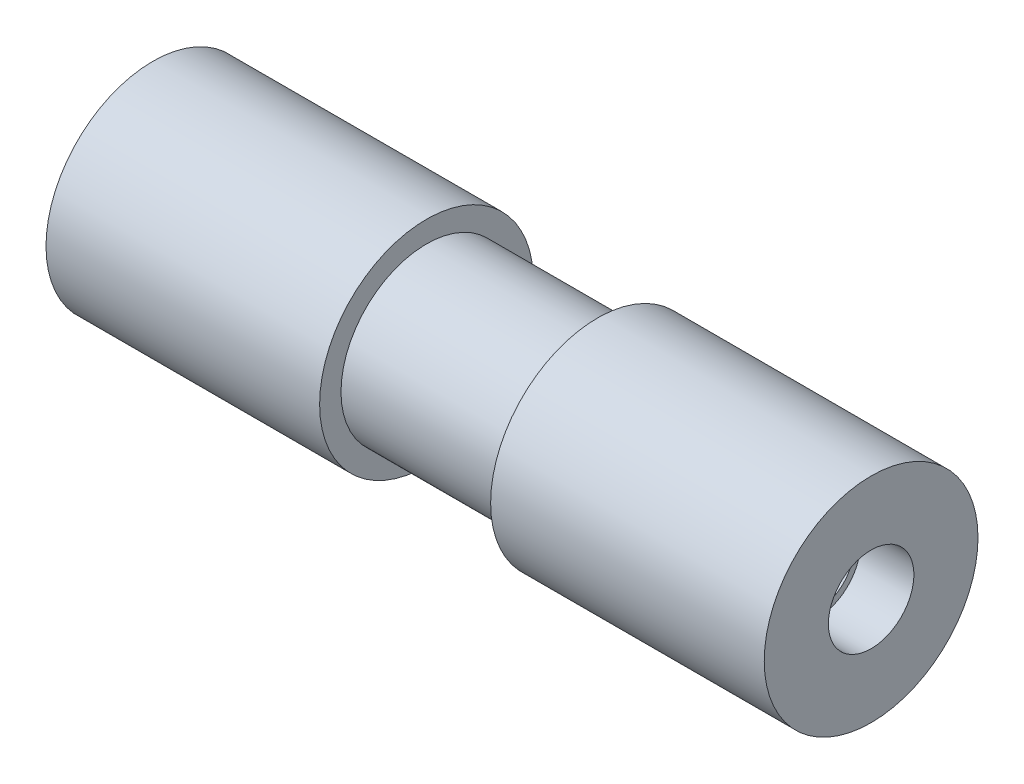
ISO-10303-21;
HEADER;
FILE_DESCRIPTION(('STEP AP214'),'2;1');
FILE_NAME('part.step','',(''),(''),'','','');
FILE_SCHEMA(('AUTOMOTIVE_DESIGN { 1 0 10303 214 1 1 1 1 }'));
ENDSEC;
DATA;
#1=APPLICATION_CONTEXT('core data for automotive mechanical design processes');
#2=APPLICATION_PROTOCOL_DEFINITION('international standard','automotive_design',2000,#1);
#3=PRODUCT_CONTEXT('',#1,'mechanical');
#4=PRODUCT('Part','Part','',(#3));
#5=PRODUCT_RELATED_PRODUCT_CATEGORY('part','',(#4));
#6=PRODUCT_DEFINITION_FORMATION('','',#4);
#7=PRODUCT_DEFINITION_CONTEXT('part definition',#1,'design');
#8=PRODUCT_DEFINITION('design','',#6,#7);
#9=PRODUCT_DEFINITION_SHAPE('','',#8);
#10=(LENGTH_UNIT() NAMED_UNIT(*) SI_UNIT(.MILLI.,.METRE.));
#11=(NAMED_UNIT(*) PLANE_ANGLE_UNIT() SI_UNIT($,.RADIAN.));
#12=(NAMED_UNIT(*) SI_UNIT($,.STERADIAN.) SOLID_ANGLE_UNIT());
#13=UNCERTAINTY_MEASURE_WITH_UNIT(LENGTH_MEASURE(1.E-05),#10,'distance_accuracy_value','');
#14=(GEOMETRIC_REPRESENTATION_CONTEXT(3) GLOBAL_UNCERTAINTY_ASSIGNED_CONTEXT((#13)) GLOBAL_UNIT_ASSIGNED_CONTEXT((#10,
#11,#12)) REPRESENTATION_CONTEXT('',''));
#15=CARTESIAN_POINT('',(0.,0.,0.));
#16=DIRECTION('',(0.,0.,1.));
#17=DIRECTION('',(1.,0.,0.));
#18=AXIS2_PLACEMENT_3D('',#15,#16,#17);
#19=CARTESIAN_POINT('',(106.68,0.,0.));
#20=DIRECTION('',(-1.,0.,0.));
#21=DIRECTION('',(0.,0.,1.));
#22=AXIS2_PLACEMENT_3D('',#19,#20,#21);
#23=CYLINDRICAL_SURFACE('',#22,31.75);
#24=CARTESIAN_POINT('',(213.36,0.,0.));
#25=DIRECTION('',(1.,0.,0.));
#26=DIRECTION('',(0.,0.,-1.));
#27=AXIS2_PLACEMENT_3D('',#24,#25,#26);
#28=CIRCLE('',#27,31.75);
#29=CARTESIAN_POINT('',(213.36,0.,-31.75));
#30=VERTEX_POINT('',#29);
#31=EDGE_CURVE('E53',#30,#30,#28,.T.);
#32=ORIENTED_EDGE('',*,*,#31,.F.);
#33=EDGE_LOOP('',(#32));
#34=FACE_BOUND('',#33,.T.);
#35=CARTESIAN_POINT('',(132.08,0.,0.));
#36=DIRECTION('',(-1.,0.,0.));
#37=DIRECTION('',(0.,0.,1.));
#38=AXIS2_PLACEMENT_3D('',#35,#36,#37);
#39=CIRCLE('',#38,31.75);
#40=CARTESIAN_POINT('',(132.08,0.,31.75));
#41=VERTEX_POINT('',#40);
#42=EDGE_CURVE('E36',#41,#41,#39,.T.);
#43=ORIENTED_EDGE('',*,*,#42,.F.);
#44=EDGE_LOOP('',(#43));
#45=FACE_BOUND('',#44,.T.);
#46=ADVANCED_FACE('F32',(#34,#45),#23,.T.);
#47=CARTESIAN_POINT('',(106.68,0.,0.));
#48=DIRECTION('',(-1.,0.,0.));
#49=DIRECTION('',(0.,0.,1.));
#50=AXIS2_PLACEMENT_3D('',#47,#48,#49);
#51=CYLINDRICAL_SURFACE('',#50,10.795);
#52=CARTESIAN_POINT('',(15.875,0.,0.));
#53=DIRECTION('',(-1.,0.,0.));
#54=DIRECTION('',(0.,0.,1.));
#55=AXIS2_PLACEMENT_3D('',#52,#53,#54);
#56=CIRCLE('',#55,10.795);
#57=CARTESIAN_POINT('',(15.875,0.,10.795));
#58=VERTEX_POINT('',#57);
#59=EDGE_CURVE('E40',#58,#58,#56,.T.);
#60=ORIENTED_EDGE('',*,*,#59,.T.);
#61=EDGE_LOOP('',(#60));
#62=FACE_BOUND('',#61,.T.);
#63=CARTESIAN_POINT('',(197.485,0.,0.));
#64=DIRECTION('',(1.,0.,0.));
#65=DIRECTION('',(0.,0.,-1.));
#66=AXIS2_PLACEMENT_3D('',#63,#64,#65);
#67=CIRCLE('',#66,10.795);
#68=CARTESIAN_POINT('',(197.485,0.,-10.795));
#69=VERTEX_POINT('',#68);
#70=EDGE_CURVE('E51',#69,#69,#67,.T.);
#71=ORIENTED_EDGE('',*,*,#70,.T.);
#72=EDGE_LOOP('',(#71));
#73=FACE_BOUND('',#72,.T.);
#74=ADVANCED_FACE('F91',(#62,#73),#51,.F.);
#75=CARTESIAN_POINT('',(213.36,0.,0.));
#76=DIRECTION('',(-1.,0.,0.));
#77=DIRECTION('',(0.,0.,-1.));
#78=AXIS2_PLACEMENT_3D('',#75,#76,#77);
#79=PLANE('',#78);
#80=ORIENTED_EDGE('',*,*,#31,.T.);
#81=EDGE_LOOP('',(#80));
#82=FACE_BOUND('',#81,.T.);
#83=CARTESIAN_POINT('',(213.36,0.,0.));
#84=DIRECTION('',(-1.,0.,0.));
#85=DIRECTION('',(0.,0.,1.));
#86=AXIS2_PLACEMENT_3D('',#83,#84,#85);
#87=CIRCLE('',#86,12.7);
#88=CARTESIAN_POINT('',(213.36,0.,12.7));
#89=VERTEX_POINT('',#88);
#90=EDGE_CURVE('E61',#89,#89,#87,.T.);
#91=ORIENTED_EDGE('',*,*,#90,.T.);
#92=EDGE_LOOP('',(#91));
#93=FACE_BOUND('',#92,.T.);
#94=ADVANCED_FACE('F86',(#82,#93),#79,.F.);
#95=CARTESIAN_POINT('',(0.,0.,0.));
#96=DIRECTION('',(1.,0.,0.));
#97=DIRECTION('',(0.,0.,-1.));
#98=AXIS2_PLACEMENT_3D('',#95,#96,#97);
#99=PLANE('',#98);
#100=CARTESIAN_POINT('',(0.,0.,0.));
#101=DIRECTION('',(-1.,0.,0.));
#102=DIRECTION('',(0.,0.,1.));
#103=AXIS2_PLACEMENT_3D('',#100,#101,#102);
#104=CIRCLE('',#103,12.7);
#105=CARTESIAN_POINT('',(0.,0.,12.7));
#106=VERTEX_POINT('',#105);
#107=EDGE_CURVE('E48',#106,#106,#104,.T.);
#108=ORIENTED_EDGE('',*,*,#107,.F.);
#109=EDGE_LOOP('',(#108));
#110=FACE_BOUND('',#109,.T.);
#111=CARTESIAN_POINT('',(0.,0.,0.));
#112=DIRECTION('',(1.,0.,0.));
#113=DIRECTION('',(0.,0.,-1.));
#114=AXIS2_PLACEMENT_3D('',#111,#112,#113);
#115=CIRCLE('',#114,31.75);
#116=CARTESIAN_POINT('',(0.,0.,-31.75));
#117=VERTEX_POINT('',#116);
#118=EDGE_CURVE('E11',#117,#117,#115,.T.);
#119=ORIENTED_EDGE('',*,*,#118,.F.);
#120=EDGE_LOOP('',(#119));
#121=FACE_BOUND('',#120,.T.);
#122=ADVANCED_FACE('F83',(#110,#121),#99,.F.);
#123=CARTESIAN_POINT('',(81.28,0.,0.));
#124=DIRECTION('',(-1.,0.,0.));
#125=DIRECTION('',(0.,0.,1.));
#126=AXIS2_PLACEMENT_3D('',#123,#124,#125);
#127=CIRCLE('',#126,31.75);
#128=CARTESIAN_POINT('',(81.28,0.,31.75));
#129=VERTEX_POINT('',#128);
#130=EDGE_CURVE('E55',#129,#129,#127,.T.);
#131=ORIENTED_EDGE('',*,*,#130,.T.);
#132=EDGE_LOOP('',(#131));
#133=FACE_BOUND('',#132,.T.);
#134=ORIENTED_EDGE('',*,*,#118,.T.);
#135=EDGE_LOOP('',(#134));
#136=FACE_BOUND('',#135,.T.);
#137=ADVANCED_FACE('F34',(#133,#136),#23,.T.);
#138=CARTESIAN_POINT('',(15.875,0.,0.));
#139=DIRECTION('',(-1.,0.,0.));
#140=DIRECTION('',(0.,0.,1.));
#141=AXIS2_PLACEMENT_3D('',#138,#139,#140);
#142=CYLINDRICAL_SURFACE('',#141,12.7);
#143=CARTESIAN_POINT('',(15.875,0.,0.));
#144=DIRECTION('',(-1.,0.,0.));
#145=DIRECTION('',(0.,0.,1.));
#146=AXIS2_PLACEMENT_3D('',#143,#144,#145);
#147=CIRCLE('',#146,12.7);
#148=CARTESIAN_POINT('',(15.875,0.,12.7));
#149=VERTEX_POINT('',#148);
#150=EDGE_CURVE('E45',#149,#149,#147,.T.);
#151=ORIENTED_EDGE('',*,*,#150,.F.);
#152=EDGE_LOOP('',(#151));
#153=FACE_BOUND('',#152,.T.);
#154=ORIENTED_EDGE('',*,*,#107,.T.);
#155=EDGE_LOOP('',(#154));
#156=FACE_BOUND('',#155,.T.);
#157=ADVANCED_FACE('F81',(#153,#156),#142,.F.);
#158=CARTESIAN_POINT('',(15.875,0.,0.));
#159=DIRECTION('',(-1.,0.,0.));
#160=DIRECTION('',(0.,0.,1.));
#161=AXIS2_PLACEMENT_3D('',#158,#159,#160);
#162=PLANE('',#161);
#163=ORIENTED_EDGE('',*,*,#59,.F.);
#164=EDGE_LOOP('',(#163));
#165=FACE_BOUND('',#164,.T.);
#166=ORIENTED_EDGE('',*,*,#150,.T.);
#167=EDGE_LOOP('',(#166));
#168=FACE_BOUND('',#167,.T.);
#169=ADVANCED_FACE('F124',(#165,#168),#162,.T.);
#170=CARTESIAN_POINT('',(197.485,0.,0.));
#171=DIRECTION('',(1.,0.,0.));
#172=DIRECTION('',(0.,0.,-1.));
#173=AXIS2_PLACEMENT_3D('',#170,#171,#172);
#174=CYLINDRICAL_SURFACE('',#173,12.7);
#175=CARTESIAN_POINT('',(197.485,0.,0.));
#176=DIRECTION('',(-1.,0.,0.));
#177=DIRECTION('',(0.,0.,1.));
#178=AXIS2_PLACEMENT_3D('',#175,#176,#177);
#179=CIRCLE('',#178,12.7);
#180=CARTESIAN_POINT('',(197.485,0.,12.7));
#181=VERTEX_POINT('',#180);
#182=EDGE_CURVE('E54',#181,#181,#179,.T.);
#183=ORIENTED_EDGE('',*,*,#182,.T.);
#184=EDGE_LOOP('',(#183));
#185=FACE_BOUND('',#184,.T.);
#186=ORIENTED_EDGE('',*,*,#90,.F.);
#187=EDGE_LOOP('',(#186));
#188=FACE_BOUND('',#187,.T.);
#189=ADVANCED_FACE('F118',(#185,#188),#174,.F.);
#190=CARTESIAN_POINT('',(197.485,0.,0.));
#191=DIRECTION('',(1.,0.,0.));
#192=DIRECTION('',(0.,0.,1.));
#193=AXIS2_PLACEMENT_3D('',#190,#191,#192);
#194=PLANE('',#193);
#195=ORIENTED_EDGE('',*,*,#70,.F.);
#196=EDGE_LOOP('',(#195));
#197=FACE_BOUND('',#196,.T.);
#198=ORIENTED_EDGE('',*,*,#182,.F.);
#199=EDGE_LOOP('',(#198));
#200=FACE_BOUND('',#199,.T.);
#201=ADVANCED_FACE('F108',(#197,#200),#194,.T.);
#202=CARTESIAN_POINT('',(132.08,0.,0.));
#203=DIRECTION('',(-1.,0.,0.));
#204=DIRECTION('',(0.,0.,1.));
#205=AXIS2_PLACEMENT_3D('',#202,#203,#204);
#206=PLANE('',#205);
#207=CARTESIAN_POINT('',(132.08,0.,0.));
#208=DIRECTION('',(-1.,0.,0.));
#209=DIRECTION('',(0.,0.,1.));
#210=AXIS2_PLACEMENT_3D('',#207,#208,#209);
#211=CIRCLE('',#210,25.4);
#212=CARTESIAN_POINT('',(132.08,0.,25.4));
#213=VERTEX_POINT('',#212);
#214=EDGE_CURVE('E57',#213,#213,#211,.T.);
#215=ORIENTED_EDGE('',*,*,#214,.F.);
#216=EDGE_LOOP('',(#215));
#217=FACE_BOUND('',#216,.T.);
#218=ORIENTED_EDGE('',*,*,#42,.T.);
#219=EDGE_LOOP('',(#218));
#220=FACE_BOUND('',#219,.T.);
#221=ADVANCED_FACE('F105',(#217,#220),#206,.T.);
#222=CARTESIAN_POINT('',(81.28,0.,0.));
#223=DIRECTION('',(-1.,0.,0.));
#224=DIRECTION('',(0.,0.,1.));
#225=AXIS2_PLACEMENT_3D('',#222,#223,#224);
#226=PLANE('',#225);
#227=CARTESIAN_POINT('',(81.28,0.,0.));
#228=DIRECTION('',(-1.,0.,0.));
#229=DIRECTION('',(0.,0.,1.));
#230=AXIS2_PLACEMENT_3D('',#227,#228,#229);
#231=CIRCLE('',#230,25.4);
#232=CARTESIAN_POINT('',(81.28,0.,25.4));
#233=VERTEX_POINT('',#232);
#234=EDGE_CURVE('E63',#233,#233,#231,.T.);
#235=ORIENTED_EDGE('',*,*,#234,.T.);
#236=EDGE_LOOP('',(#235));
#237=FACE_BOUND('',#236,.T.);
#238=ORIENTED_EDGE('',*,*,#130,.F.);
#239=EDGE_LOOP('',(#238));
#240=FACE_BOUND('',#239,.T.);
#241=ADVANCED_FACE('F107',(#237,#240),#226,.F.);
#242=CARTESIAN_POINT('',(132.08,0.,0.));
#243=DIRECTION('',(-1.,0.,0.));
#244=DIRECTION('',(0.,0.,1.));
#245=AXIS2_PLACEMENT_3D('',#242,#243,#244);
#246=CYLINDRICAL_SURFACE('',#245,25.4);
#247=ORIENTED_EDGE('',*,*,#214,.T.);
#248=EDGE_LOOP('',(#247));
#249=FACE_BOUND('',#248,.T.);
#250=ORIENTED_EDGE('',*,*,#234,.F.);
#251=EDGE_LOOP('',(#250));
#252=FACE_BOUND('',#251,.T.);
#253=ADVANCED_FACE('F115',(#249,#252),#246,.T.);
#254=CLOSED_SHELL('',(#46,#74,#94,#122,#137,#157,#169,#189,#201,#221,#241,#253));
#255=MANIFOLD_SOLID_BREP('B2',#254);
#256=ADVANCED_BREP_SHAPE_REPRESENTATION('',(#18,#255),#14);
#257=SHAPE_DEFINITION_REPRESENTATION(#9,#256);
ENDSEC;
END-ISO-10303-21;
